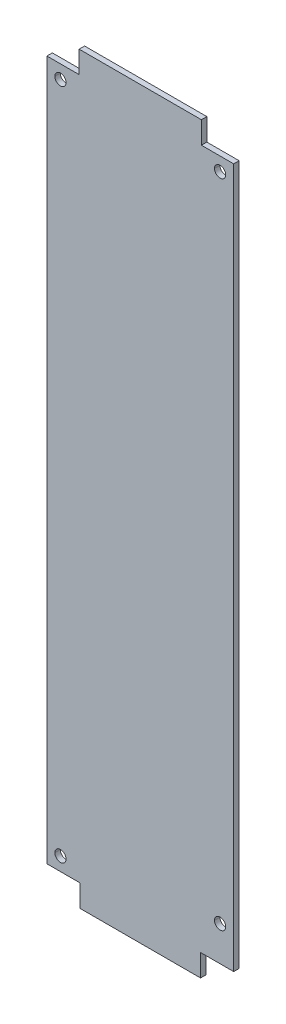
ISO-10303-21;
HEADER;
FILE_DESCRIPTION(('STEP AP214'),'2;1');
FILE_NAME('part.step','',(''),(''),'','','');
FILE_SCHEMA(('AUTOMOTIVE_DESIGN { 1 0 10303 214 1 1 1 1 }'));
ENDSEC;
DATA;
#1=APPLICATION_CONTEXT('core data for automotive mechanical design processes');
#2=APPLICATION_PROTOCOL_DEFINITION('international standard','automotive_design',2000,#1);
#3=PRODUCT_CONTEXT('',#1,'mechanical');
#4=PRODUCT('Part','Part','',(#3));
#5=PRODUCT_RELATED_PRODUCT_CATEGORY('part','',(#4));
#6=PRODUCT_DEFINITION_FORMATION('','',#4);
#7=PRODUCT_DEFINITION_CONTEXT('part definition',#1,'design');
#8=PRODUCT_DEFINITION('design','',#6,#7);
#9=PRODUCT_DEFINITION_SHAPE('','',#8);
#10=(LENGTH_UNIT() NAMED_UNIT(*) SI_UNIT(.MILLI.,.METRE.));
#11=(NAMED_UNIT(*) PLANE_ANGLE_UNIT() SI_UNIT($,.RADIAN.));
#12=(NAMED_UNIT(*) SI_UNIT($,.STERADIAN.) SOLID_ANGLE_UNIT());
#13=UNCERTAINTY_MEASURE_WITH_UNIT(LENGTH_MEASURE(1.E-05),#10,'distance_accuracy_value','');
#14=(GEOMETRIC_REPRESENTATION_CONTEXT(3) GLOBAL_UNCERTAINTY_ASSIGNED_CONTEXT((#13)) GLOBAL_UNIT_ASSIGNED_CONTEXT((#10,
#11,#12)) REPRESENTATION_CONTEXT('',''));
#15=CARTESIAN_POINT('',(0.,0.,0.));
#16=DIRECTION('',(0.,0.,1.));
#17=DIRECTION('',(1.,0.,0.));
#18=AXIS2_PLACEMENT_3D('',#15,#16,#17);
#19=CARTESIAN_POINT('',(76.07314706862,67.15993342998,182.8399727922));
#20=DIRECTION('',(0.,0.,1.));
#21=DIRECTION('',(1.,0.,0.));
#22=AXIS2_PLACEMENT_3D('',#19,#20,#21);
#23=CYLINDRICAL_SURFACE('',#22,1.64999924);
#24=CARTESIAN_POINT('',(76.07314706862,67.15993342998,184.5999751922));
#25=DIRECTION('',(0.,0.,1.));
#26=DIRECTION('',(-1.,0.,0.));
#27=AXIS2_PLACEMENT_3D('',#24,#25,#26);
#28=CIRCLE('',#27,1.64999924);
#29=CARTESIAN_POINT('',(77.72314630862,67.15993342998,184.5999751922));
#30=VERTEX_POINT('',#29);
#31=CARTESIAN_POINT('',(74.42314782862,67.15993342998,184.5999751922));
#32=VERTEX_POINT('',#31);
#33=EDGE_CURVE('E252',#30,#32,#28,.T.);
#34=ORIENTED_EDGE('',*,*,#33,.T.);
#35=DIRECTION('',(0.,0.,1.));
#36=VECTOR('',#35,1.);
#37=CARTESIAN_POINT('',(74.42314782862,67.15993342998,182.8399727922));
#38=LINE('',#37,#36);
#39=CARTESIAN_POINT('',(74.42314782862,67.15993342998,182.9999751922));
#40=VERTEX_POINT('',#39);
#41=EDGE_CURVE('E263',#40,#32,#38,.T.);
#42=ORIENTED_EDGE('',*,*,#41,.F.);
#43=CARTESIAN_POINT('',(76.07314706862,67.15993342998,182.9999751922));
#44=DIRECTION('',(0.,0.,-1.));
#45=DIRECTION('',(1.,0.,0.));
#46=AXIS2_PLACEMENT_3D('',#43,#44,#45);
#47=CIRCLE('',#46,1.64999924);
#48=CARTESIAN_POINT('',(77.72314630862,67.15993342998,182.9999751922));
#49=VERTEX_POINT('',#48);
#50=EDGE_CURVE('E456',#40,#49,#47,.T.);
#51=ORIENTED_EDGE('',*,*,#50,.T.);
#52=DIRECTION('',(0.,0.,1.));
#53=VECTOR('',#52,1.);
#54=CARTESIAN_POINT('',(77.72314630862,67.15993342998,182.8399727922));
#55=LINE('',#54,#53);
#56=EDGE_CURVE('E260',#49,#30,#55,.T.);
#57=ORIENTED_EDGE('',*,*,#56,.T.);
#58=EDGE_LOOP('',(#34,#42,#51,#57));
#59=FACE_BOUND('',#58,.T.);
#60=ADVANCED_FACE('F17',(#59),#23,.F.);
#61=CARTESIAN_POINT('',(29.07314762864,258.9099311728,182.8399727922));
#62=DIRECTION('',(0.,0.,1.));
#63=DIRECTION('',(1.,0.,0.));
#64=AXIS2_PLACEMENT_3D('',#61,#62,#63);
#65=CYLINDRICAL_SURFACE('',#64,1.64999924);
#66=DIRECTION('',(0.,0.,1.));
#67=VECTOR('',#66,1.);
#68=CARTESIAN_POINT('',(30.72314686864,258.9099311728,182.8399727922));
#69=LINE('',#68,#67);
#70=CARTESIAN_POINT('',(30.72314686864,258.9099311728,182.9999751922));
#71=VERTEX_POINT('',#70);
#72=CARTESIAN_POINT('',(30.72314686864,258.9099311728,184.5999751922));
#73=VERTEX_POINT('',#72);
#74=EDGE_CURVE('E269',#71,#73,#69,.T.);
#75=ORIENTED_EDGE('',*,*,#74,.F.);
#76=CARTESIAN_POINT('',(29.07314762864,258.9099311728,182.9999751922));
#77=DIRECTION('',(0.,0.,-1.));
#78=DIRECTION('',(1.,0.,0.));
#79=AXIS2_PLACEMENT_3D('',#76,#77,#78);
#80=CIRCLE('',#79,1.64999924);
#81=CARTESIAN_POINT('',(27.42314838864,258.9099311728,182.9999751922));
#82=VERTEX_POINT('',#81);
#83=EDGE_CURVE('E441',#71,#82,#80,.T.);
#84=ORIENTED_EDGE('',*,*,#83,.T.);
#85=DIRECTION('',(0.,0.,1.));
#86=VECTOR('',#85,1.);
#87=CARTESIAN_POINT('',(27.42314838864,258.9099311728,182.8399727922));
#88=LINE('',#87,#86);
#89=CARTESIAN_POINT('',(27.42314838864,258.9099311728,184.5999751922));
#90=VERTEX_POINT('',#89);
#91=EDGE_CURVE('E268',#82,#90,#88,.T.);
#92=ORIENTED_EDGE('',*,*,#91,.T.);
#93=CARTESIAN_POINT('',(29.07314762864,258.9099311728,184.5999751922));
#94=DIRECTION('',(0.,0.,1.));
#95=DIRECTION('',(-1.,0.,0.));
#96=AXIS2_PLACEMENT_3D('',#93,#94,#95);
#97=CIRCLE('',#96,1.64999924);
#98=EDGE_CURVE('E187',#90,#73,#97,.T.);
#99=ORIENTED_EDGE('',*,*,#98,.T.);
#100=EDGE_LOOP('',(#75,#84,#92,#99));
#101=FACE_BOUND('',#100,.T.);
#102=ADVANCED_FACE('F636',(#101),#65,.F.);
#103=CARTESIAN_POINT('',(76.07314706864,258.9099311728,182.8399727922));
#104=DIRECTION('',(0.,0.,1.));
#105=DIRECTION('',(1.,0.,0.));
#106=AXIS2_PLACEMENT_3D('',#103,#104,#105);
#107=CYLINDRICAL_SURFACE('',#106,1.64999924);
#108=CARTESIAN_POINT('',(76.07314706864,258.9099311728,182.9999751922));
#109=DIRECTION('',(0.,0.,-1.));
#110=DIRECTION('',(1.,0.,0.));
#111=AXIS2_PLACEMENT_3D('',#108,#109,#110);
#112=CIRCLE('',#111,1.64999924);
#113=CARTESIAN_POINT('',(74.42314782864,258.9099311728,182.9999751922));
#114=VERTEX_POINT('',#113);
#115=CARTESIAN_POINT('',(77.72314630864,258.9099311728,182.9999751922));
#116=VERTEX_POINT('',#115);
#117=EDGE_CURVE('E434',#114,#116,#112,.T.);
#118=ORIENTED_EDGE('',*,*,#117,.T.);
#119=DIRECTION('',(0.,0.,1.));
#120=VECTOR('',#119,1.);
#121=CARTESIAN_POINT('',(77.72314630864,258.9099311728,182.8399727922));
#122=LINE('',#121,#120);
#123=CARTESIAN_POINT('',(77.72314630864,258.9099311728,184.5999751922));
#124=VERTEX_POINT('',#123);
#125=EDGE_CURVE('E25',#116,#124,#122,.T.);
#126=ORIENTED_EDGE('',*,*,#125,.T.);
#127=CARTESIAN_POINT('',(76.07314706864,258.9099311728,184.5999751922));
#128=DIRECTION('',(0.,0.,1.));
#129=DIRECTION('',(-1.,0.,0.));
#130=AXIS2_PLACEMENT_3D('',#127,#128,#129);
#131=CIRCLE('',#130,1.64999924);
#132=CARTESIAN_POINT('',(74.42314782864,258.9099311728,184.5999751922));
#133=VERTEX_POINT('',#132);
#134=EDGE_CURVE('E178',#124,#133,#131,.T.);
#135=ORIENTED_EDGE('',*,*,#134,.T.);
#136=DIRECTION('',(0.,0.,1.));
#137=VECTOR('',#136,1.);
#138=CARTESIAN_POINT('',(74.42314782864,258.9099311728,182.8399727922));
#139=LINE('',#138,#137);
#140=EDGE_CURVE('E11',#114,#133,#139,.T.);
#141=ORIENTED_EDGE('',*,*,#140,.F.);
#142=EDGE_LOOP('',(#118,#126,#135,#141));
#143=FACE_BOUND('',#142,.T.);
#144=ADVANCED_FACE('F179',(#143),#107,.F.);
#145=CARTESIAN_POINT('',(29.07314762864,60.9099310515,182.8399727922));
#146=DIRECTION('',(0.,0.,1.));
#147=DIRECTION('',(1.,0.,0.));
#148=AXIS2_PLACEMENT_3D('',#145,#146,#147);
#149=CYLINDRICAL_SURFACE('',#148,1.64999924);
#150=DIRECTION('',(0.,0.,1.));
#151=VECTOR('',#150,1.);
#152=CARTESIAN_POINT('',(30.72314686864,60.9099310515,182.8399727922));
#153=LINE('',#152,#151);
#154=CARTESIAN_POINT('',(30.72314686864,60.9099310515,182.9999751922));
#155=VERTEX_POINT('',#154);
#156=CARTESIAN_POINT('',(30.72314686864,60.9099310515,184.5999751922));
#157=VERTEX_POINT('',#156);
#158=EDGE_CURVE('E37',#155,#157,#153,.T.);
#159=ORIENTED_EDGE('',*,*,#158,.T.);
#160=CARTESIAN_POINT('',(29.07314762864,60.9099310515,184.5999751922));
#161=DIRECTION('',(0.,0.,1.));
#162=DIRECTION('',(-1.,0.,0.));
#163=AXIS2_PLACEMENT_3D('',#160,#161,#162);
#164=CIRCLE('',#163,1.64999924);
#165=CARTESIAN_POINT('',(27.42314838864,60.9099310515,184.5999751922));
#166=VERTEX_POINT('',#165);
#167=EDGE_CURVE('E303',#157,#166,#164,.T.);
#168=ORIENTED_EDGE('',*,*,#167,.T.);
#169=DIRECTION('',(0.,0.,1.));
#170=VECTOR('',#169,1.);
#171=CARTESIAN_POINT('',(27.42314838864,60.9099310515,182.8399727922));
#172=LINE('',#171,#170);
#173=CARTESIAN_POINT('',(27.42314838864,60.9099310515,182.9999751922));
#174=VERTEX_POINT('',#173);
#175=EDGE_CURVE('E50',#174,#166,#172,.T.);
#176=ORIENTED_EDGE('',*,*,#175,.F.);
#177=CARTESIAN_POINT('',(29.07314762864,60.9099310515,182.9999751922));
#178=DIRECTION('',(0.,0.,-1.));
#179=DIRECTION('',(1.,0.,0.));
#180=AXIS2_PLACEMENT_3D('',#177,#178,#179);
#181=CIRCLE('',#180,1.64999924);
#182=EDGE_CURVE('E415',#174,#155,#181,.T.);
#183=ORIENTED_EDGE('',*,*,#182,.T.);
#184=EDGE_LOOP('',(#159,#168,#176,#183));
#185=FACE_BOUND('',#184,.T.);
#186=ADVANCED_FACE('F647',(#185),#149,.F.);
#187=CARTESIAN_POINT('',(76.07314706864,258.9099311728,182.8399727922));
#188=DIRECTION('',(0.,0.,1.));
#189=DIRECTION('',(1.,0.,0.));
#190=AXIS2_PLACEMENT_3D('',#187,#188,#189);
#191=CYLINDRICAL_SURFACE('',#190,1.64999924);
#192=CARTESIAN_POINT('',(76.07314706864,258.9099311728,184.5999751922));
#193=DIRECTION('',(0.,0.,1.));
#194=DIRECTION('',(-1.,0.,0.));
#195=AXIS2_PLACEMENT_3D('',#192,#193,#194);
#196=CIRCLE('',#195,1.64999924);
#197=EDGE_CURVE('E171',#133,#124,#196,.T.);
#198=ORIENTED_EDGE('',*,*,#197,.T.);
#199=ORIENTED_EDGE('',*,*,#125,.F.);
#200=CARTESIAN_POINT('',(76.07314706864,258.9099311728,182.9999751922));
#201=DIRECTION('',(0.,0.,-1.));
#202=DIRECTION('',(1.,0.,0.));
#203=AXIS2_PLACEMENT_3D('',#200,#201,#202);
#204=CIRCLE('',#203,1.64999924);
#205=EDGE_CURVE('E173',#116,#114,#204,.T.);
#206=ORIENTED_EDGE('',*,*,#205,.T.);
#207=ORIENTED_EDGE('',*,*,#140,.T.);
#208=EDGE_LOOP('',(#198,#199,#206,#207));
#209=FACE_BOUND('',#208,.T.);
#210=ADVANCED_FACE('F169',(#209),#191,.F.);
#211=CARTESIAN_POINT('',(29.07314762864,258.9099311728,182.8399727922));
#212=DIRECTION('',(0.,0.,1.));
#213=DIRECTION('',(1.,0.,0.));
#214=AXIS2_PLACEMENT_3D('',#211,#212,#213);
#215=CYLINDRICAL_SURFACE('',#214,1.64999924);
#216=CARTESIAN_POINT('',(29.07314762864,258.9099311728,184.5999751922));
#217=DIRECTION('',(0.,0.,1.));
#218=DIRECTION('',(-1.,0.,0.));
#219=AXIS2_PLACEMENT_3D('',#216,#217,#218);
#220=CIRCLE('',#219,1.64999924);
#221=EDGE_CURVE('E194',#73,#90,#220,.T.);
#222=ORIENTED_EDGE('',*,*,#221,.T.);
#223=ORIENTED_EDGE('',*,*,#91,.F.);
#224=CARTESIAN_POINT('',(29.07314762864,258.9099311728,182.9999751922));
#225=DIRECTION('',(0.,0.,-1.));
#226=DIRECTION('',(1.,0.,0.));
#227=AXIS2_PLACEMENT_3D('',#224,#225,#226);
#228=CIRCLE('',#227,1.64999924);
#229=EDGE_CURVE('E448',#82,#71,#228,.T.);
#230=ORIENTED_EDGE('',*,*,#229,.T.);
#231=ORIENTED_EDGE('',*,*,#74,.T.);
#232=EDGE_LOOP('',(#222,#223,#230,#231));
#233=FACE_BOUND('',#232,.T.);
#234=ADVANCED_FACE('F654',(#233),#215,.F.);
#235=CARTESIAN_POINT('',(29.07314762864,60.9099310515,182.8399727922));
#236=DIRECTION('',(0.,0.,1.));
#237=DIRECTION('',(1.,0.,0.));
#238=AXIS2_PLACEMENT_3D('',#235,#236,#237);
#239=CYLINDRICAL_SURFACE('',#238,1.64999924);
#240=CARTESIAN_POINT('',(29.07314762864,60.9099310515,182.9999751922));
#241=DIRECTION('',(0.,0.,-1.));
#242=DIRECTION('',(1.,0.,0.));
#243=AXIS2_PLACEMENT_3D('',#240,#241,#242);
#244=CIRCLE('',#243,1.64999924);
#245=EDGE_CURVE('E423',#155,#174,#244,.T.);
#246=ORIENTED_EDGE('',*,*,#245,.T.);
#247=ORIENTED_EDGE('',*,*,#175,.T.);
#248=CARTESIAN_POINT('',(29.07314762864,60.9099310515,184.5999751922));
#249=DIRECTION('',(0.,0.,1.));
#250=DIRECTION('',(-1.,0.,0.));
#251=AXIS2_PLACEMENT_3D('',#248,#249,#250);
#252=CIRCLE('',#251,1.64999924);
#253=EDGE_CURVE('E182',#166,#157,#252,.T.);
#254=ORIENTED_EDGE('',*,*,#253,.T.);
#255=ORIENTED_EDGE('',*,*,#158,.F.);
#256=EDGE_LOOP('',(#246,#247,#254,#255));
#257=FACE_BOUND('',#256,.T.);
#258=ADVANCED_FACE('F631',(#257),#239,.F.);
#259=CARTESIAN_POINT('',(76.07314706862,67.15993342998,182.8399727922));
#260=DIRECTION('',(0.,0.,1.));
#261=DIRECTION('',(1.,0.,0.));
#262=AXIS2_PLACEMENT_3D('',#259,#260,#261);
#263=CYLINDRICAL_SURFACE('',#262,1.64999924);
#264=CARTESIAN_POINT('',(76.07314706862,67.15993342998,182.9999751922));
#265=DIRECTION('',(0.,0.,-1.));
#266=DIRECTION('',(1.,0.,0.));
#267=AXIS2_PLACEMENT_3D('',#264,#265,#266);
#268=CIRCLE('',#267,1.64999924);
#269=EDGE_CURVE('E465',#49,#40,#268,.T.);
#270=ORIENTED_EDGE('',*,*,#269,.T.);
#271=ORIENTED_EDGE('',*,*,#41,.T.);
#272=CARTESIAN_POINT('',(76.07314706862,67.15993342998,184.5999751922));
#273=DIRECTION('',(0.,0.,1.));
#274=DIRECTION('',(-1.,0.,0.));
#275=AXIS2_PLACEMENT_3D('',#272,#273,#274);
#276=CIRCLE('',#275,1.64999924);
#277=EDGE_CURVE('E256',#32,#30,#276,.T.);
#278=ORIENTED_EDGE('',*,*,#277,.T.);
#279=ORIENTED_EDGE('',*,*,#56,.F.);
#280=EDGE_LOOP('',(#270,#271,#278,#279));
#281=FACE_BOUND('',#280,.T.);
#282=ADVANCED_FACE('F618',(#281),#263,.F.);
#283=CARTESIAN_POINT('',(31.63601707725,66.04746592775,184.5999751922));
#284=DIRECTION('',(0.,0.,1.));
#285=DIRECTION('',(1.,0.,0.));
#286=AXIS2_PLACEMENT_3D('',#283,#284,#285);
#287=PLANE('',#286);
#288=ORIENTED_EDGE('',*,*,#253,.F.);
#289=ORIENTED_EDGE('',*,*,#167,.F.);
#290=EDGE_LOOP('',(#288,#289));
#291=FACE_BOUND('',#290,.T.);
#292=ORIENTED_EDGE('',*,*,#197,.F.);
#293=ORIENTED_EDGE('',*,*,#134,.F.);
#294=EDGE_LOOP('',(#292,#293));
#295=FACE_BOUND('',#294,.T.);
#296=ORIENTED_EDGE('',*,*,#221,.F.);
#297=ORIENTED_EDGE('',*,*,#98,.F.);
#298=EDGE_LOOP('',(#296,#297));
#299=FACE_BOUND('',#298,.T.);
#300=ORIENTED_EDGE('',*,*,#33,.F.);
#301=ORIENTED_EDGE('',*,*,#277,.F.);
#302=EDGE_LOOP('',(#300,#301));
#303=FACE_BOUND('',#302,.T.);
#304=DIRECTION('',(0.,-1.,0.));
#305=VECTOR('',#304,1.);
#306=CARTESIAN_POINT('',(70.32314390864,56.90993109283,184.5999751922));
#307=LINE('',#306,#305);
#308=CARTESIAN_POINT('',(70.32314390864,56.90993109283,184.5999751922));
#309=VERTEX_POINT('',#308);
#310=CARTESIAN_POINT('',(70.32314390864,50.40993139283,184.5999751922));
#311=VERTEX_POINT('',#310);
#312=EDGE_CURVE('E249',#309,#311,#307,.T.);
#313=ORIENTED_EDGE('',*,*,#312,.F.);
#314=DIRECTION('',(1.,0.,0.));
#315=VECTOR('',#314,1.);
#316=CARTESIAN_POINT('',(70.32314390864,56.90993109283,184.5999751922));
#317=LINE('',#316,#315);
#318=CARTESIAN_POINT('',(80.07314772864,56.90993109283,184.5999751922));
#319=VERTEX_POINT('',#318);
#320=EDGE_CURVE('E242',#309,#319,#317,.T.);
#321=ORIENTED_EDGE('',*,*,#320,.T.);
#322=DIRECTION('',(0.,-1.,0.));
#323=VECTOR('',#322,1.);
#324=CARTESIAN_POINT('',(80.07314772864,262.9099307928,184.5999751922));
#325=LINE('',#324,#323);
#326=CARTESIAN_POINT('',(80.07314772864,262.9099307928,184.5999751922));
#327=VERTEX_POINT('',#326);
#328=EDGE_CURVE('E237',#327,#319,#325,.T.);
#329=ORIENTED_EDGE('',*,*,#328,.F.);
#330=DIRECTION('',(1.,0.,0.));
#331=VECTOR('',#330,1.);
#332=CARTESIAN_POINT('',(70.57314848864,262.9099307928,184.5999751922));
#333=LINE('',#332,#331);
#334=CARTESIAN_POINT('',(70.57314848864,262.9099307928,184.5999751922));
#335=VERTEX_POINT('',#334);
#336=EDGE_CURVE('E229',#335,#327,#333,.T.);
#337=ORIENTED_EDGE('',*,*,#336,.F.);
#338=DIRECTION('',(0.,-1.,0.));
#339=VECTOR('',#338,1.);
#340=CARTESIAN_POINT('',(70.57314848864,269.4099304928,184.5999751922));
#341=LINE('',#340,#339);
#342=CARTESIAN_POINT('',(70.57314848864,269.4099304928,184.5999751922));
#343=VERTEX_POINT('',#342);
#344=EDGE_CURVE('E220',#343,#335,#341,.T.);
#345=ORIENTED_EDGE('',*,*,#344,.F.);
#346=DIRECTION('',(1.,0.,0.));
#347=VECTOR('',#346,1.);
#348=CARTESIAN_POINT('',(34.57314874864,269.4099304928,184.5999751922));
#349=LINE('',#348,#347);
#350=CARTESIAN_POINT('',(34.57314874864,269.4099304928,184.5999751922));
#351=VERTEX_POINT('',#350);
#352=EDGE_CURVE('E221',#351,#343,#349,.T.);
#353=ORIENTED_EDGE('',*,*,#352,.F.);
#354=DIRECTION('',(0.,-1.,0.));
#355=VECTOR('',#354,1.);
#356=CARTESIAN_POINT('',(34.57314874864,269.4099304928,184.5999751922));
#357=LINE('',#356,#355);
#358=CARTESIAN_POINT('',(34.57314874864,262.9099307928,184.5999751922));
#359=VERTEX_POINT('',#358);
#360=EDGE_CURVE('E214',#351,#359,#357,.T.);
#361=ORIENTED_EDGE('',*,*,#360,.T.);
#362=DIRECTION('',(1.,0.,0.));
#363=VECTOR('',#362,1.);
#364=CARTESIAN_POINT('',(25.07314696864,262.9099307928,184.5999751922));
#365=LINE('',#364,#363);
#366=CARTESIAN_POINT('',(25.07314696864,262.9099307928,184.5999751922));
#367=VERTEX_POINT('',#366);
#368=EDGE_CURVE('E206',#367,#359,#365,.T.);
#369=ORIENTED_EDGE('',*,*,#368,.F.);
#370=DIRECTION('',(0.,1.,0.));
#371=VECTOR('',#370,1.);
#372=CARTESIAN_POINT('',(25.07314696864,56.90993109283,184.5999751922));
#373=LINE('',#372,#371);
#374=CARTESIAN_POINT('',(25.07314696864,56.90993109283,184.5999751922));
#375=VERTEX_POINT('',#374);
#376=EDGE_CURVE('E200',#375,#367,#373,.T.);
#377=ORIENTED_EDGE('',*,*,#376,.F.);
#378=DIRECTION('',(1.,0.,0.));
#379=VECTOR('',#378,1.);
#380=CARTESIAN_POINT('',(25.07314696864,56.90993109283,184.5999751922));
#381=LINE('',#380,#379);
#382=CARTESIAN_POINT('',(34.82314874864,56.90993109283,184.5999751922));
#383=VERTEX_POINT('',#382);
#384=EDGE_CURVE('E198',#375,#383,#381,.T.);
#385=ORIENTED_EDGE('',*,*,#384,.T.);
#386=DIRECTION('',(0.,-1.,0.));
#387=VECTOR('',#386,1.);
#388=CARTESIAN_POINT('',(34.82314874864,56.90993109283,184.5999751922));
#389=LINE('',#388,#387);
#390=CARTESIAN_POINT('',(34.82314874864,50.40993139283,184.5999751922));
#391=VERTEX_POINT('',#390);
#392=EDGE_CURVE('E388',#383,#391,#389,.T.);
#393=ORIENTED_EDGE('',*,*,#392,.T.);
#394=DIRECTION('',(1.,0.,0.));
#395=VECTOR('',#394,1.);
#396=CARTESIAN_POINT('',(34.82314874864,50.40993139283,184.5999751922));
#397=LINE('',#396,#395);
#398=EDGE_CURVE('E400',#391,#311,#397,.T.);
#399=ORIENTED_EDGE('',*,*,#398,.T.);
#400=EDGE_LOOP('',(#313,#321,#329,#337,#345,#353,#361,#369,#377,#385,#393,#399));
#401=FACE_BOUND('',#400,.T.);
#402=ADVANCED_FACE('F184',(#291,#295,#299,#303,#401),#287,.T.);
#403=CARTESIAN_POINT('',(70.32314390864,56.90993109283,182.9999751922));
#404=DIRECTION('',(1.,0.,0.));
#405=DIRECTION('',(0.,1.,0.));
#406=AXIS2_PLACEMENT_3D('',#403,#404,#405);
#407=PLANE('',#406);
#408=DIRECTION('',(0.,-1.,0.));
#409=VECTOR('',#408,1.);
#410=CARTESIAN_POINT('',(70.32314390864,56.90993109283,182.9999751922));
#411=LINE('',#410,#409);
#412=CARTESIAN_POINT('',(70.32314390864,56.90993109283,182.9999751922));
#413=VERTEX_POINT('',#412);
#414=CARTESIAN_POINT('',(70.32314390864,50.40993139283,182.9999751922));
#415=VERTEX_POINT('',#414);
#416=EDGE_CURVE('E474',#413,#415,#411,.T.);
#417=ORIENTED_EDGE('',*,*,#416,.F.);
#418=DIRECTION('',(0.,0.,-1.));
#419=VECTOR('',#418,1.);
#420=CARTESIAN_POINT('',(70.32314390864,56.90993109283,184.5999751922));
#421=LINE('',#420,#419);
#422=EDGE_CURVE('E245',#309,#413,#421,.T.);
#423=ORIENTED_EDGE('',*,*,#422,.F.);
#424=ORIENTED_EDGE('',*,*,#312,.T.);
#425=DIRECTION('',(0.,0.,-1.));
#426=VECTOR('',#425,1.);
#427=CARTESIAN_POINT('',(70.32314390864,50.40993139283,184.5999751922));
#428=LINE('',#427,#426);
#429=EDGE_CURVE('E407',#311,#415,#428,.T.);
#430=ORIENTED_EDGE('',*,*,#429,.T.);
#431=EDGE_LOOP('',(#417,#423,#424,#430));
#432=FACE_BOUND('',#431,.T.);
#433=ADVANCED_FACE('F621',(#432),#407,.T.);
#434=CARTESIAN_POINT('',(80.32314772864,56.90993109283,182.9999751922));
#435=DIRECTION('',(0.,-1.,0.));
#436=DIRECTION('',(0.,0.,-1.));
#437=AXIS2_PLACEMENT_3D('',#434,#435,#436);
#438=PLANE('',#437);
#439=DIRECTION('',(1.,0.,0.));
#440=VECTOR('',#439,1.);
#441=CARTESIAN_POINT('',(70.32314390864,56.90993109283,182.9999751922));
#442=LINE('',#441,#440);
#443=CARTESIAN_POINT('',(80.07314772864,56.90993109283,182.9999751922));
#444=VERTEX_POINT('',#443);
#445=EDGE_CURVE('E481',#413,#444,#442,.T.);
#446=ORIENTED_EDGE('',*,*,#445,.T.);
#447=DIRECTION('',(0.,0.,-1.));
#448=VECTOR('',#447,1.);
#449=CARTESIAN_POINT('',(80.07314772864,56.90993109283,184.5999751922));
#450=LINE('',#449,#448);
#451=EDGE_CURVE('E241',#319,#444,#450,.T.);
#452=ORIENTED_EDGE('',*,*,#451,.F.);
#453=ORIENTED_EDGE('',*,*,#320,.F.);
#454=ORIENTED_EDGE('',*,*,#422,.T.);
#455=EDGE_LOOP('',(#446,#452,#453,#454));
#456=FACE_BOUND('',#455,.T.);
#457=ADVANCED_FACE('F571',(#456),#438,.T.);
#458=CARTESIAN_POINT('',(80.07314772864,253.9099307928,182.9999751922));
#459=DIRECTION('',(1.,0.,0.));
#460=DIRECTION('',(0.,1.,0.));
#461=AXIS2_PLACEMENT_3D('',#458,#459,#460);
#462=PLANE('',#461);
#463=DIRECTION('',(0.,-1.,0.));
#464=VECTOR('',#463,1.);
#465=CARTESIAN_POINT('',(80.07314772864,262.9099307928,182.9999751922));
#466=LINE('',#465,#464);
#467=CARTESIAN_POINT('',(80.07314772864,262.9099307928,182.9999751922));
#468=VERTEX_POINT('',#467);
#469=EDGE_CURVE('E488',#468,#444,#466,.T.);
#470=ORIENTED_EDGE('',*,*,#469,.F.);
#471=DIRECTION('',(0.,0.,1.));
#472=VECTOR('',#471,1.);
#473=CARTESIAN_POINT('',(80.07314772864,262.9099307928,182.9999751922));
#474=LINE('',#473,#472);
#475=EDGE_CURVE('E233',#468,#327,#474,.T.);
#476=ORIENTED_EDGE('',*,*,#475,.T.);
#477=ORIENTED_EDGE('',*,*,#328,.T.);
#478=ORIENTED_EDGE('',*,*,#451,.T.);
#479=EDGE_LOOP('',(#470,#476,#477,#478));
#480=FACE_BOUND('',#479,.T.);
#481=ADVANCED_FACE('F567',(#480),#462,.T.);
#482=CARTESIAN_POINT('',(72.32314848864,262.9099307928,182.9999751922));
#483=DIRECTION('',(0.,1.,0.));
#484=DIRECTION('',(1.,0.,0.));
#485=AXIS2_PLACEMENT_3D('',#482,#483,#484);
#486=PLANE('',#485);
#487=DIRECTION('',(1.,0.,0.));
#488=VECTOR('',#487,1.);
#489=CARTESIAN_POINT('',(70.57314848864,262.9099307928,182.9999751922));
#490=LINE('',#489,#488);
#491=CARTESIAN_POINT('',(70.57314848864,262.9099307928,182.9999751922));
#492=VERTEX_POINT('',#491);
#493=EDGE_CURVE('E494',#492,#468,#490,.T.);
#494=ORIENTED_EDGE('',*,*,#493,.F.);
#495=DIRECTION('',(0.,0.,-1.));
#496=VECTOR('',#495,1.);
#497=CARTESIAN_POINT('',(70.57314848864,262.9099307928,184.5999751922));
#498=LINE('',#497,#496);
#499=EDGE_CURVE('E226',#335,#492,#498,.T.);
#500=ORIENTED_EDGE('',*,*,#499,.F.);
#501=ORIENTED_EDGE('',*,*,#336,.T.);
#502=ORIENTED_EDGE('',*,*,#475,.F.);
#503=EDGE_LOOP('',(#494,#500,#501,#502));
#504=FACE_BOUND('',#503,.T.);
#505=ADVANCED_FACE('F580',(#504),#486,.T.);
#506=CARTESIAN_POINT('',(70.57314848864,269.4099304928,182.9999751922));
#507=DIRECTION('',(1.,0.,0.));
#508=DIRECTION('',(0.,1.,0.));
#509=AXIS2_PLACEMENT_3D('',#506,#507,#508);
#510=PLANE('',#509);
#511=DIRECTION('',(0.,-1.,0.));
#512=VECTOR('',#511,1.);
#513=CARTESIAN_POINT('',(70.57314848864,269.4099304928,182.9999751922));
#514=LINE('',#513,#512);
#515=CARTESIAN_POINT('',(70.57314848864,269.4099304928,182.9999751922));
#516=VERTEX_POINT('',#515);
#517=EDGE_CURVE('E500',#516,#492,#514,.T.);
#518=ORIENTED_EDGE('',*,*,#517,.F.);
#519=DIRECTION('',(0.,0.,-1.));
#520=VECTOR('',#519,1.);
#521=CARTESIAN_POINT('',(70.57314848864,269.4099304928,184.5999751922));
#522=LINE('',#521,#520);
#523=EDGE_CURVE('E218',#343,#516,#522,.T.);
#524=ORIENTED_EDGE('',*,*,#523,.F.);
#525=ORIENTED_EDGE('',*,*,#344,.T.);
#526=ORIENTED_EDGE('',*,*,#499,.T.);
#527=EDGE_LOOP('',(#518,#524,#525,#526));
#528=FACE_BOUND('',#527,.T.);
#529=ADVANCED_FACE('F660',(#528),#510,.T.);
#530=CARTESIAN_POINT('',(32.82314874864,269.4099304928,182.9999751922));
#531=DIRECTION('',(0.,1.,0.));
#532=DIRECTION('',(1.,0.,0.));
#533=AXIS2_PLACEMENT_3D('',#530,#531,#532);
#534=PLANE('',#533);
#535=DIRECTION('',(1.,0.,0.));
#536=VECTOR('',#535,1.);
#537=CARTESIAN_POINT('',(34.57314874864,269.4099304928,182.9999751922));
#538=LINE('',#537,#536);
#539=CARTESIAN_POINT('',(34.57314874864,269.4099304928,182.9999751922));
#540=VERTEX_POINT('',#539);
#541=EDGE_CURVE('E506',#540,#516,#538,.T.);
#542=ORIENTED_EDGE('',*,*,#541,.F.);
#543=DIRECTION('',(0.,0.,-1.));
#544=VECTOR('',#543,1.);
#545=CARTESIAN_POINT('',(34.57314874864,269.4099304928,184.5999751922));
#546=LINE('',#545,#544);
#547=EDGE_CURVE('E217',#351,#540,#546,.T.);
#548=ORIENTED_EDGE('',*,*,#547,.F.);
#549=ORIENTED_EDGE('',*,*,#352,.T.);
#550=ORIENTED_EDGE('',*,*,#523,.T.);
#551=EDGE_LOOP('',(#542,#548,#549,#550));
#552=FACE_BOUND('',#551,.T.);
#553=ADVANCED_FACE('F663',(#552),#534,.T.);
#554=CARTESIAN_POINT('',(34.57314874864,262.9099307928,182.9999751922));
#555=DIRECTION('',(-1.,0.,0.));
#556=DIRECTION('',(0.,0.,1.));
#557=AXIS2_PLACEMENT_3D('',#554,#555,#556);
#558=PLANE('',#557);
#559=DIRECTION('',(0.,-1.,0.));
#560=VECTOR('',#559,1.);
#561=CARTESIAN_POINT('',(34.57314874864,269.4099304928,182.9999751922));
#562=LINE('',#561,#560);
#563=CARTESIAN_POINT('',(34.57314874864,262.9099307928,182.9999751922));
#564=VERTEX_POINT('',#563);
#565=EDGE_CURVE('E512',#540,#564,#562,.T.);
#566=ORIENTED_EDGE('',*,*,#565,.T.);
#567=DIRECTION('',(0.,0.,-1.));
#568=VECTOR('',#567,1.);
#569=CARTESIAN_POINT('',(34.57314874864,262.9099307928,184.5999751922));
#570=LINE('',#569,#568);
#571=EDGE_CURVE('E210',#359,#564,#570,.T.);
#572=ORIENTED_EDGE('',*,*,#571,.F.);
#573=ORIENTED_EDGE('',*,*,#360,.F.);
#574=ORIENTED_EDGE('',*,*,#547,.T.);
#575=EDGE_LOOP('',(#566,#572,#573,#574));
#576=FACE_BOUND('',#575,.T.);
#577=ADVANCED_FACE('F667',(#576),#558,.T.);
#578=CARTESIAN_POINT('',(24.82314696864,262.9099307928,182.9999751922));
#579=DIRECTION('',(0.,1.,0.));
#580=DIRECTION('',(1.,0.,0.));
#581=AXIS2_PLACEMENT_3D('',#578,#579,#580);
#582=PLANE('',#581);
#583=DIRECTION('',(1.,0.,0.));
#584=VECTOR('',#583,1.);
#585=CARTESIAN_POINT('',(25.07314696864,262.9099307928,182.9999751922));
#586=LINE('',#585,#584);
#587=CARTESIAN_POINT('',(25.07314696864,262.9099307928,182.9999751922));
#588=VERTEX_POINT('',#587);
#589=EDGE_CURVE('E518',#588,#564,#586,.T.);
#590=ORIENTED_EDGE('',*,*,#589,.F.);
#591=DIRECTION('',(0.,0.,-1.));
#592=VECTOR('',#591,1.);
#593=CARTESIAN_POINT('',(25.07314696864,262.9099307928,184.5999751922));
#594=LINE('',#593,#592);
#595=EDGE_CURVE('E204',#367,#588,#594,.T.);
#596=ORIENTED_EDGE('',*,*,#595,.F.);
#597=ORIENTED_EDGE('',*,*,#368,.T.);
#598=ORIENTED_EDGE('',*,*,#571,.T.);
#599=EDGE_LOOP('',(#590,#596,#597,#598));
#600=FACE_BOUND('',#599,.T.);
#601=ADVANCED_FACE('F671',(#600),#582,.T.);
#602=CARTESIAN_POINT('',(25.07314696864,56.90993109283,182.9999751922));
#603=DIRECTION('',(-1.,0.,0.));
#604=DIRECTION('',(0.,0.,1.));
#605=AXIS2_PLACEMENT_3D('',#602,#603,#604);
#606=PLANE('',#605);
#607=DIRECTION('',(0.,1.,0.));
#608=VECTOR('',#607,1.);
#609=CARTESIAN_POINT('',(25.07314696864,56.90993109283,182.9999751922));
#610=LINE('',#609,#608);
#611=CARTESIAN_POINT('',(25.07314696864,56.90993109283,182.9999751922));
#612=VERTEX_POINT('',#611);
#613=EDGE_CURVE('E524',#612,#588,#610,.T.);
#614=ORIENTED_EDGE('',*,*,#613,.F.);
#615=DIRECTION('',(0.,0.,1.));
#616=VECTOR('',#615,1.);
#617=CARTESIAN_POINT('',(25.07314696864,56.90993109283,182.9999751922));
#618=LINE('',#617,#616);
#619=EDGE_CURVE('E205',#612,#375,#618,.T.);
#620=ORIENTED_EDGE('',*,*,#619,.T.);
#621=ORIENTED_EDGE('',*,*,#376,.T.);
#622=ORIENTED_EDGE('',*,*,#595,.T.);
#623=EDGE_LOOP('',(#614,#620,#621,#622));
#624=FACE_BOUND('',#623,.T.);
#625=ADVANCED_FACE('F677',(#624),#606,.T.);
#626=CARTESIAN_POINT('',(32.82314874864,56.90993109283,182.9999751922));
#627=DIRECTION('',(0.,-1.,0.));
#628=DIRECTION('',(0.,0.,-1.));
#629=AXIS2_PLACEMENT_3D('',#626,#627,#628);
#630=PLANE('',#629);
#631=DIRECTION('',(1.,0.,0.));
#632=VECTOR('',#631,1.);
#633=CARTESIAN_POINT('',(25.07314696864,56.90993109283,182.9999751922));
#634=LINE('',#633,#632);
#635=CARTESIAN_POINT('',(34.82314874864,56.90993109283,182.9999751922));
#636=VERTEX_POINT('',#635);
#637=EDGE_CURVE('E530',#612,#636,#634,.T.);
#638=ORIENTED_EDGE('',*,*,#637,.T.);
#639=DIRECTION('',(0.,0.,-1.));
#640=VECTOR('',#639,1.);
#641=CARTESIAN_POINT('',(34.82314874864,56.90993109283,184.5999751922));
#642=LINE('',#641,#640);
#643=EDGE_CURVE('E383',#383,#636,#642,.T.);
#644=ORIENTED_EDGE('',*,*,#643,.F.);
#645=ORIENTED_EDGE('',*,*,#384,.F.);
#646=ORIENTED_EDGE('',*,*,#619,.F.);
#647=EDGE_LOOP('',(#638,#644,#645,#646));
#648=FACE_BOUND('',#647,.T.);
#649=ADVANCED_FACE('F681',(#648),#630,.T.);
#650=CARTESIAN_POINT('',(34.82314874864,50.40993139283,182.9999751922));
#651=DIRECTION('',(-1.,0.,0.));
#652=DIRECTION('',(0.,0.,1.));
#653=AXIS2_PLACEMENT_3D('',#650,#651,#652);
#654=PLANE('',#653);
#655=DIRECTION('',(0.,-1.,0.));
#656=VECTOR('',#655,1.);
#657=CARTESIAN_POINT('',(34.82314874864,56.90993109283,182.9999751922));
#658=LINE('',#657,#656);
#659=CARTESIAN_POINT('',(34.82314874864,50.40993139283,182.9999751922));
#660=VERTEX_POINT('',#659);
#661=EDGE_CURVE('E536',#636,#660,#658,.T.);
#662=ORIENTED_EDGE('',*,*,#661,.T.);
#663=DIRECTION('',(0.,0.,-1.));
#664=VECTOR('',#663,1.);
#665=CARTESIAN_POINT('',(34.82314874864,50.40993139283,184.5999751922));
#666=LINE('',#665,#664);
#667=EDGE_CURVE('E393',#391,#660,#666,.T.);
#668=ORIENTED_EDGE('',*,*,#667,.F.);
#669=ORIENTED_EDGE('',*,*,#392,.F.);
#670=ORIENTED_EDGE('',*,*,#643,.T.);
#671=EDGE_LOOP('',(#662,#668,#669,#670));
#672=FACE_BOUND('',#671,.T.);
#673=ADVANCED_FACE('F687',(#672),#654,.T.);
#674=CARTESIAN_POINT('',(72.32314848864,50.40993139283,182.9999751922));
#675=DIRECTION('',(0.,-1.,0.));
#676=DIRECTION('',(0.,0.,-1.));
#677=AXIS2_PLACEMENT_3D('',#674,#675,#676);
#678=PLANE('',#677);
#679=DIRECTION('',(1.,0.,0.));
#680=VECTOR('',#679,1.);
#681=CARTESIAN_POINT('',(34.82314874864,50.40993139283,182.9999751922));
#682=LINE('',#681,#680);
#683=EDGE_CURVE('E543',#660,#415,#682,.T.);
#684=ORIENTED_EDGE('',*,*,#683,.T.);
#685=ORIENTED_EDGE('',*,*,#429,.F.);
#686=ORIENTED_EDGE('',*,*,#398,.F.);
#687=ORIENTED_EDGE('',*,*,#667,.T.);
#688=EDGE_LOOP('',(#684,#685,#686,#687));
#689=FACE_BOUND('',#688,.T.);
#690=ADVANCED_FACE('F693',(#689),#678,.T.);
#691=CARTESIAN_POINT('',(31.63601707725,66.04746592775,182.9999751922));
#692=DIRECTION('',(0.,0.,1.));
#693=DIRECTION('',(1.,0.,0.));
#694=AXIS2_PLACEMENT_3D('',#691,#692,#693);
#695=PLANE('',#694);
#696=ORIENTED_EDGE('',*,*,#245,.F.);
#697=ORIENTED_EDGE('',*,*,#182,.F.);
#698=EDGE_LOOP('',(#696,#697));
#699=FACE_BOUND('',#698,.T.);
#700=ORIENTED_EDGE('',*,*,#117,.F.);
#701=ORIENTED_EDGE('',*,*,#205,.F.);
#702=EDGE_LOOP('',(#700,#701));
#703=FACE_BOUND('',#702,.T.);
#704=ORIENTED_EDGE('',*,*,#229,.F.);
#705=ORIENTED_EDGE('',*,*,#83,.F.);
#706=EDGE_LOOP('',(#704,#705));
#707=FACE_BOUND('',#706,.T.);
#708=ORIENTED_EDGE('',*,*,#269,.F.);
#709=ORIENTED_EDGE('',*,*,#50,.F.);
#710=EDGE_LOOP('',(#708,#709));
#711=FACE_BOUND('',#710,.T.);
#712=ORIENTED_EDGE('',*,*,#683,.F.);
#713=ORIENTED_EDGE('',*,*,#661,.F.);
#714=ORIENTED_EDGE('',*,*,#637,.F.);
#715=ORIENTED_EDGE('',*,*,#613,.T.);
#716=ORIENTED_EDGE('',*,*,#589,.T.);
#717=ORIENTED_EDGE('',*,*,#565,.F.);
#718=ORIENTED_EDGE('',*,*,#541,.T.);
#719=ORIENTED_EDGE('',*,*,#517,.T.);
#720=ORIENTED_EDGE('',*,*,#493,.T.);
#721=ORIENTED_EDGE('',*,*,#469,.T.);
#722=ORIENTED_EDGE('',*,*,#445,.F.);
#723=ORIENTED_EDGE('',*,*,#416,.T.);
#724=EDGE_LOOP('',(#712,#713,#714,#715,#716,#717,#718,#719,#720,#721,#722,#723));
#725=FACE_BOUND('',#724,.T.);
#726=ADVANCED_FACE('F575',(#699,#703,#707,#711,#725),#695,.F.);
#727=CLOSED_SHELL('',(#60,#102,#144,#186,#210,#234,#258,#282,#402,#433,#457,#481,#505,#529,#553,
#577,#601,#625,#649,#673,#690,#726));
#728=MANIFOLD_SOLID_BREP('B1',#727);
#729=ADVANCED_BREP_SHAPE_REPRESENTATION('',(#18,#728),#14);
#730=SHAPE_DEFINITION_REPRESENTATION(#9,#729);
ENDSEC;
END-ISO-10303-21;
